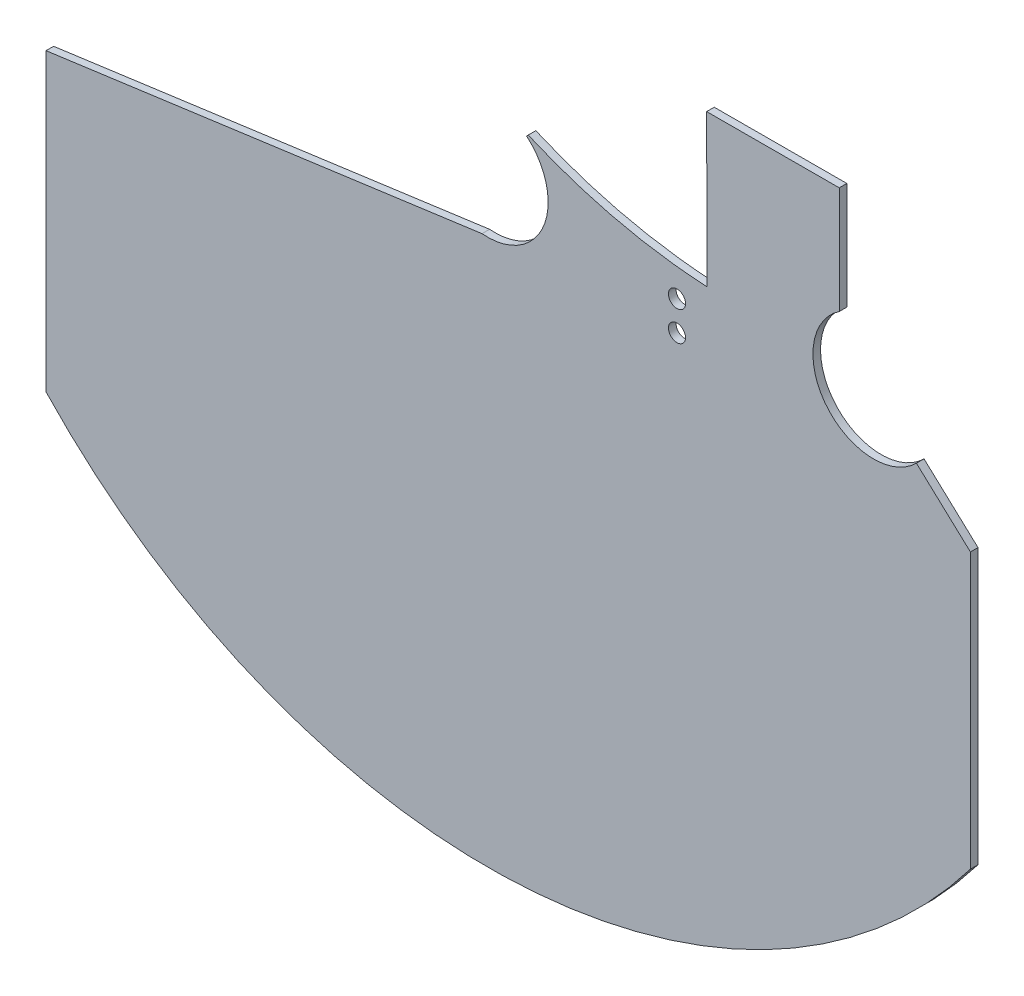
ISO-10303-21;
HEADER;
FILE_DESCRIPTION(('STEP AP214'),'2;1');
FILE_NAME('part.step','',(''),(''),'','','');
FILE_SCHEMA(('AUTOMOTIVE_DESIGN { 1 0 10303 214 1 1 1 1 }'));
ENDSEC;
DATA;
#1=APPLICATION_CONTEXT('core data for automotive mechanical design processes');
#2=APPLICATION_PROTOCOL_DEFINITION('international standard','automotive_design',2000,#1);
#3=PRODUCT_CONTEXT('',#1,'mechanical');
#4=PRODUCT('Part','Part','',(#3));
#5=PRODUCT_RELATED_PRODUCT_CATEGORY('part','',(#4));
#6=PRODUCT_DEFINITION_FORMATION('','',#4);
#7=PRODUCT_DEFINITION_CONTEXT('part definition',#1,'design');
#8=PRODUCT_DEFINITION('design','',#6,#7);
#9=PRODUCT_DEFINITION_SHAPE('','',#8);
#10=(LENGTH_UNIT() NAMED_UNIT(*) SI_UNIT(.MILLI.,.METRE.));
#11=(NAMED_UNIT(*) PLANE_ANGLE_UNIT() SI_UNIT($,.RADIAN.));
#12=(NAMED_UNIT(*) SI_UNIT($,.STERADIAN.) SOLID_ANGLE_UNIT());
#13=UNCERTAINTY_MEASURE_WITH_UNIT(LENGTH_MEASURE(1.E-05),#10,'distance_accuracy_value','');
#14=(GEOMETRIC_REPRESENTATION_CONTEXT(3) GLOBAL_UNCERTAINTY_ASSIGNED_CONTEXT((#13)) GLOBAL_UNIT_ASSIGNED_CONTEXT((#10,
#11,#12)) REPRESENTATION_CONTEXT('',''));
#15=CARTESIAN_POINT('',(0.,0.,0.));
#16=DIRECTION('',(0.,0.,1.));
#17=DIRECTION('',(1.,0.,0.));
#18=AXIS2_PLACEMENT_3D('',#15,#16,#17);
#19=CARTESIAN_POINT('',(-64.6239887447356,-14.0460748970825,2.));
#20=CARTESIAN_POINT('',(-63.2083175092721,-14.6547052125629,2.));
#21=CARTESIAN_POINT('',(-59.2352547633828,-16.2885486222811,2.));
#22=CARTESIAN_POINT('',(-52.6835599549813,-18.6412966622868,2.));
#23=CARTESIAN_POINT('',(-44.8960667093759,-20.9332737764106,2.));
#24=CARTESIAN_POINT('',(-33.2641089987974,-23.6191312021915,2.));
#25=CARTESIAN_POINT('',(-24.0616058058238,-24.7787283025548,2.));
#26=CARTESIAN_POINT('',(-17.4428852931268,-25.1385360129051,2.));
#27=B_SPLINE_CURVE_WITH_KNOTS('',3,(#19,#20,#21,#22,#23,#24,#25,#26),.UNSPECIFIED.,.F.,.F.,(4,1,
1,1,1,4),(0.0547903109001073,0.11986733723747,0.23631613153048,0.35276492582349,0.4692137201165,
0.751953644688164),.UNSPECIFIED.);
#28=DIRECTION('',(0.,0.,-1.));
#29=VECTOR('',#28,1.);
#30=SURFACE_OF_LINEAR_EXTRUSION('',#27,#29);
#31=CARTESIAN_POINT('',(-64.6239887447356,-14.0460748970825,0.));
#32=CARTESIAN_POINT('',(-63.2083175092721,-14.6547052125629,0.));
#33=CARTESIAN_POINT('',(-59.2352547633828,-16.2885486222811,0.));
#34=CARTESIAN_POINT('',(-52.6835599549813,-18.6412966622868,0.));
#35=CARTESIAN_POINT('',(-44.8960667093759,-20.9332737764106,0.));
#36=CARTESIAN_POINT('',(-33.2641089987974,-23.6191312021915,0.));
#37=CARTESIAN_POINT('',(-24.0616058058238,-24.7787283025548,0.));
#38=CARTESIAN_POINT('',(-17.4428852931268,-25.1385360129051,0.));
#39=B_SPLINE_CURVE_WITH_KNOTS('',3,(#31,#32,#33,#34,#35,#36,#37,#38),.UNSPECIFIED.,.F.,.F.,(4,1,
1,1,1,4),(0.0547903109001073,0.11986733723747,0.23631613153048,0.35276492582349,0.4692137201165,
0.751953644688164),.UNSPECIFIED.);
#40=CARTESIAN_POINT('',(-64.6239887448273,-14.0460748970428,0.));
#41=VERTEX_POINT('',#40);
#42=CARTESIAN_POINT('',(-17.4428852931608,-25.1385360129033,0.));
#43=VERTEX_POINT('',#42);
#44=EDGE_CURVE('E159',#41,#43,#39,.T.);
#45=ORIENTED_EDGE('',*,*,#44,.F.);
#46=DIRECTION('',(0.,0.,-1.));
#47=VECTOR('',#46,1.);
#48=CARTESIAN_POINT('',(-64.6239887448273,-14.0460748970428,2.));
#49=LINE('',#48,#47);
#50=CARTESIAN_POINT('',(-64.6239887448273,-14.0460748970428,2.));
#51=VERTEX_POINT('',#50);
#52=EDGE_CURVE('E11',#51,#41,#49,.T.);
#53=ORIENTED_EDGE('',*,*,#52,.F.);
#54=CARTESIAN_POINT('',(-17.4428852931608,-25.1385360129033,2.));
#55=VERTEX_POINT('',#54);
#56=EDGE_CURVE('E201',#51,#55,#27,.T.);
#57=ORIENTED_EDGE('',*,*,#56,.T.);
#58=DIRECTION('',(0.,0.,-1.));
#59=VECTOR('',#58,1.);
#60=CARTESIAN_POINT('',(-17.4428852931608,-25.1385360129033,2.));
#61=LINE('',#60,#59);
#62=EDGE_CURVE('E98',#55,#43,#61,.T.);
#63=ORIENTED_EDGE('',*,*,#62,.T.);
#64=EDGE_LOOP('',(#45,#53,#57,#63));
#65=FACE_BOUND('',#64,.T.);
#66=ADVANCED_FACE('F35',(#65),#30,.T.);
#67=CARTESIAN_POINT('',(-25.2889529104566,25.2889560515686,2.));
#68=DIRECTION('',(-0.707106737272085,0.707106825101007,0.));
#69=DIRECTION('',(-0.707106825101007,-0.707106737272085,0.));
#70=AXIS2_PLACEMENT_3D('',#67,#68,#69);
#71=PLANE('',#70);
#72=DIRECTION('',(0.707106825101007,0.707106737272085,0.));
#73=VECTOR('',#72,1.);
#74=CARTESIAN_POINT('',(-25.2889529104566,25.2889560515686,0.));
#75=LINE('',#74,#73);
#76=CARTESIAN_POINT('',(-65.0722011186989,-14.4942872152425,0.));
#77=VERTEX_POINT('',#76);
#78=EDGE_CURVE('E164',#77,#41,#75,.T.);
#79=ORIENTED_EDGE('',*,*,#78,.F.);
#80=DIRECTION('',(0.,0.,-1.));
#81=VECTOR('',#80,1.);
#82=CARTESIAN_POINT('',(-65.0722011186989,-14.4942872152425,2.));
#83=LINE('',#82,#81);
#84=CARTESIAN_POINT('',(-65.0722011186989,-14.4942872152425,2.));
#85=VERTEX_POINT('',#84);
#86=EDGE_CURVE('E44',#85,#77,#83,.T.);
#87=ORIENTED_EDGE('',*,*,#86,.F.);
#88=DIRECTION('',(0.707106825101007,0.707106737272085,0.));
#89=VECTOR('',#88,1.);
#90=CARTESIAN_POINT('',(-25.2889529104566,25.2889560515686,2.));
#91=LINE('',#90,#89);
#92=EDGE_CURVE('E232',#85,#51,#91,.T.);
#93=ORIENTED_EDGE('',*,*,#92,.T.);
#94=ORIENTED_EDGE('',*,*,#52,.T.);
#95=EDGE_LOOP('',(#79,#87,#93,#94));
#96=FACE_BOUND('',#95,.T.);
#97=ADVANCED_FACE('F231',(#96),#71,.T.);
#98=CARTESIAN_POINT('',(-75.3616109764839,-26.7469622202588,2.));
#99=DIRECTION('',(0.,0.,-1.));
#100=DIRECTION('',(-1.,0.,0.));
#101=AXIS2_PLACEMENT_3D('',#98,#99,#100);
#102=CYLINDRICAL_SURFACE('',#101,15.9999999999994);
#103=CARTESIAN_POINT('',(-75.3616109764839,-26.7469622202588,0.));
#104=DIRECTION('',(0.,0.,1.));
#105=DIRECTION('',(1.,0.,0.));
#106=AXIS2_PLACEMENT_3D('',#103,#104,#105);
#107=CIRCLE('',#106,15.9999999999994);
#108=CARTESIAN_POINT('',(-76.8108861217814,-42.6811895800385,0.));
#109=VERTEX_POINT('',#108);
#110=EDGE_CURVE('E170',#77,#109,#107,.F.);
#111=ORIENTED_EDGE('',*,*,#110,.T.);
#112=DIRECTION('',(0.,0.,-1.));
#113=VECTOR('',#112,1.);
#114=CARTESIAN_POINT('',(-76.8108861217814,-42.6811895800385,2.));
#115=LINE('',#114,#113);
#116=CARTESIAN_POINT('',(-76.8108861217814,-42.6811895800385,2.));
#117=VERTEX_POINT('',#116);
#118=EDGE_CURVE('E215',#117,#109,#115,.T.);
#119=ORIENTED_EDGE('',*,*,#118,.F.);
#120=CARTESIAN_POINT('',(-75.3616109764839,-26.7469622202588,2.));
#121=DIRECTION('',(0.,0.,1.));
#122=DIRECTION('',(1.,0.,0.));
#123=AXIS2_PLACEMENT_3D('',#120,#121,#122);
#124=CIRCLE('',#123,15.9999999999994);
#125=EDGE_CURVE('E222',#85,#117,#124,.F.);
#126=ORIENTED_EDGE('',*,*,#125,.F.);
#127=ORIENTED_EDGE('',*,*,#86,.T.);
#128=EDGE_LOOP('',(#111,#119,#126,#127));
#129=FACE_BOUND('',#128,.T.);
#130=ADVANCED_FACE('F220',(#129),#102,.F.);
#131=CARTESIAN_POINT('',(4.31519357882489,-31.6044268128314,2.));
#132=DIRECTION('',(0.135282451096762,-0.990807074270896,0.));
#133=DIRECTION('',(0.990807074270896,0.135282451096762,0.));
#134=AXIS2_PLACEMENT_3D('',#131,#132,#133);
#135=PLANE('',#134);
#136=DIRECTION('',(-0.990807074270896,-0.135282451096762,0.));
#137=VECTOR('',#136,1.);
#138=CARTESIAN_POINT('',(4.31519357882489,-31.6044268128314,0.));
#139=LINE('',#138,#137);
#140=CARTESIAN_POINT('',(-191.898124009468,-58.39492844576,0.));
#141=VERTEX_POINT('',#140);
#142=EDGE_CURVE('E172',#109,#141,#139,.T.);
#143=ORIENTED_EDGE('',*,*,#142,.T.);
#144=DIRECTION('',(0.,0.,-1.));
#145=VECTOR('',#144,1.);
#146=CARTESIAN_POINT('',(-191.898124009468,-58.39492844576,2.));
#147=LINE('',#146,#145);
#148=CARTESIAN_POINT('',(-191.898124009468,-58.39492844576,2.));
#149=VERTEX_POINT('',#148);
#150=EDGE_CURVE('E213',#149,#141,#147,.T.);
#151=ORIENTED_EDGE('',*,*,#150,.F.);
#152=DIRECTION('',(-0.990807074270896,-0.135282451096762,0.));
#153=VECTOR('',#152,1.);
#154=CARTESIAN_POINT('',(4.31519357882489,-31.6044268128314,2.));
#155=LINE('',#154,#153);
#156=EDGE_CURVE('E243',#117,#149,#155,.T.);
#157=ORIENTED_EDGE('',*,*,#156,.F.);
#158=ORIENTED_EDGE('',*,*,#118,.T.);
#159=EDGE_LOOP('',(#143,#151,#157,#158));
#160=FACE_BOUND('',#159,.T.);
#161=ADVANCED_FACE('F277',(#160),#135,.F.);
#162=CARTESIAN_POINT('',(-191.898124009504,-1.16508970540198E-10,2.));
#163=DIRECTION('',(-1.,-6.07139705724417E-13,0.));
#164=DIRECTION('',(6.07139705724417E-13,-1.,0.));
#165=AXIS2_PLACEMENT_3D('',#162,#163,#164);
#166=PLANE('',#165);
#167=DIRECTION('',(-6.07139705724417E-13,1.,0.));
#168=VECTOR('',#167,1.);
#169=CARTESIAN_POINT('',(-191.898124009504,-1.16508970540198E-10,0.));
#170=LINE('',#169,#168);
#171=CARTESIAN_POINT('',(-191.898124009468,-136.379261886521,0.));
#172=VERTEX_POINT('',#171);
#173=EDGE_CURVE('E175',#172,#141,#170,.T.);
#174=ORIENTED_EDGE('',*,*,#173,.F.);
#175=DIRECTION('',(0.,0.,-1.));
#176=VECTOR('',#175,1.);
#177=CARTESIAN_POINT('',(-191.898124009468,-136.379261886521,2.));
#178=LINE('',#177,#176);
#179=CARTESIAN_POINT('',(-191.898124009468,-136.379261886521,2.));
#180=VERTEX_POINT('',#179);
#181=EDGE_CURVE('E211',#180,#172,#178,.T.);
#182=ORIENTED_EDGE('',*,*,#181,.F.);
#183=DIRECTION('',(-6.07139705724417E-13,1.,0.));
#184=VECTOR('',#183,1.);
#185=CARTESIAN_POINT('',(-191.898124009504,-1.16508970540198E-10,2.));
#186=LINE('',#185,#184);
#187=EDGE_CURVE('E245',#180,#149,#186,.T.);
#188=ORIENTED_EDGE('',*,*,#187,.T.);
#189=ORIENTED_EDGE('',*,*,#150,.T.);
#190=EDGE_LOOP('',(#174,#182,#188,#189));
#191=FACE_BOUND('',#190,.T.);
#192=ADVANCED_FACE('F272',(#191),#166,.T.);
#193=CARTESIAN_POINT('',(-75.3616109764839,-26.7469622202588,2.));
#194=DIRECTION('',(0.,0.,-1.));
#195=DIRECTION('',(-1.,0.,0.));
#196=AXIS2_PLACEMENT_3D('',#193,#194,#195);
#197=CYLINDRICAL_SURFACE('',#196,160.);
#198=CARTESIAN_POINT('',(-75.3616109764839,-26.7469622202588,0.));
#199=DIRECTION('',(0.,0.,1.));
#200=DIRECTION('',(1.,0.,0.));
#201=AXIS2_PLACEMENT_3D('',#198,#199,#200);
#202=CIRCLE('',#201,160.);
#203=CARTESIAN_POINT('',(52.0837216082465,-123.482101659696,0.));
#204=VERTEX_POINT('',#203);
#205=EDGE_CURVE('E178',#172,#204,#202,.T.);
#206=ORIENTED_EDGE('',*,*,#205,.T.);
#207=DIRECTION('',(0.,0.,-1.));
#208=VECTOR('',#207,1.);
#209=CARTESIAN_POINT('',(52.0837216082465,-123.482101659696,2.));
#210=LINE('',#209,#208);
#211=CARTESIAN_POINT('',(52.0837216082465,-123.482101659696,2.));
#212=VERTEX_POINT('',#211);
#213=EDGE_CURVE('E209',#212,#204,#210,.T.);
#214=ORIENTED_EDGE('',*,*,#213,.F.);
#215=CARTESIAN_POINT('',(-75.3616109764839,-26.7469622202588,2.));
#216=DIRECTION('',(0.,0.,1.));
#217=DIRECTION('',(1.,0.,0.));
#218=AXIS2_PLACEMENT_3D('',#215,#216,#217);
#219=CIRCLE('',#218,160.);
#220=EDGE_CURVE('E248',#180,#212,#219,.T.);
#221=ORIENTED_EDGE('',*,*,#220,.F.);
#222=ORIENTED_EDGE('',*,*,#181,.T.);
#223=EDGE_LOOP('',(#206,#214,#221,#222));
#224=FACE_BOUND('',#223,.T.);
#225=ADVANCED_FACE('F269',(#224),#197,.T.);
#226=CARTESIAN_POINT('',(52.0837216082473,-3.33998055448493E-13,2.));
#227=DIRECTION('',(1.,0.,0.));
#228=DIRECTION('',(0.,1.,0.));
#229=AXIS2_PLACEMENT_3D('',#226,#227,#228);
#230=PLANE('',#229);
#231=DIRECTION('',(0.,-1.,0.));
#232=VECTOR('',#231,1.);
#233=CARTESIAN_POINT('',(52.0837216082473,-3.33998055448493E-13,0.));
#234=LINE('',#233,#232);
#235=CARTESIAN_POINT('',(52.083721608247,-50.9845866737982,0.));
#236=VERTEX_POINT('',#235);
#237=EDGE_CURVE('E181',#236,#204,#234,.T.);
#238=ORIENTED_EDGE('',*,*,#237,.F.);
#239=DIRECTION('',(0.,0.,-1.));
#240=VECTOR('',#239,1.);
#241=CARTESIAN_POINT('',(52.083721608247,-50.9845866737982,2.));
#242=LINE('',#241,#240);
#243=CARTESIAN_POINT('',(52.083721608247,-50.9845866737982,2.));
#244=VERTEX_POINT('',#243);
#245=EDGE_CURVE('E207',#244,#236,#242,.T.);
#246=ORIENTED_EDGE('',*,*,#245,.F.);
#247=DIRECTION('',(0.,-1.,0.));
#248=VECTOR('',#247,1.);
#249=CARTESIAN_POINT('',(52.0837216082473,-3.33998055448493E-13,2.));
#250=LINE('',#249,#248);
#251=EDGE_CURVE('E250',#244,#212,#250,.T.);
#252=ORIENTED_EDGE('',*,*,#251,.T.);
#253=ORIENTED_EDGE('',*,*,#213,.T.);
#254=EDGE_LOOP('',(#238,#246,#252,#253));
#255=FACE_BOUND('',#254,.T.);
#256=ADVANCED_FACE('F263',(#255),#230,.T.);
#257=CARTESIAN_POINT('',(-1.43735793991193,-1.55637741681561,2.));
#258=DIRECTION('',(-0.67845895912902,-0.734638306091894,0.));
#259=DIRECTION('',(0.734638306091894,-0.67845895912902,0.));
#260=AXIS2_PLACEMENT_3D('',#257,#258,#259);
#261=PLANE('',#260);
#262=DIRECTION('',(-0.734638306091894,0.67845895912902,0.));
#263=VECTOR('',#262,1.);
#264=CARTESIAN_POINT('',(-1.43735793991193,-1.55637741681561,0.));
#265=LINE('',#264,#263);
#266=CARTESIAN_POINT('',(37.8349632323001,-37.8254610245341,0.));
#267=VERTEX_POINT('',#266);
#268=EDGE_CURVE('E184',#236,#267,#265,.T.);
#269=ORIENTED_EDGE('',*,*,#268,.T.);
#270=DIRECTION('',(0.,0.,-1.));
#271=VECTOR('',#270,1.);
#272=CARTESIAN_POINT('',(37.8349632323001,-37.8254610245341,2.));
#273=LINE('',#272,#271);
#274=CARTESIAN_POINT('',(37.8349632323001,-37.8254610245341,2.));
#275=VERTEX_POINT('',#274);
#276=EDGE_CURVE('E205',#275,#267,#273,.T.);
#277=ORIENTED_EDGE('',*,*,#276,.F.);
#278=DIRECTION('',(-0.734638306091894,0.67845895912902,0.));
#279=VECTOR('',#278,1.);
#280=CARTESIAN_POINT('',(-1.43735793991193,-1.55637741681561,2.));
#281=LINE('',#280,#279);
#282=EDGE_CURVE('E253',#244,#275,#281,.T.);
#283=ORIENTED_EDGE('',*,*,#282,.F.);
#284=ORIENTED_EDGE('',*,*,#245,.T.);
#285=EDGE_LOOP('',(#269,#277,#283,#284));
#286=FACE_BOUND('',#285,.T.);
#287=ADVANCED_FACE('F278',(#286),#261,.F.);
#288=CARTESIAN_POINT('',(26.5181075061683,-26.5149399160011,2.));
#289=DIRECTION('',(0.,0.,-1.));
#290=DIRECTION('',(-1.,0.,0.));
#291=AXIS2_PLACEMENT_3D('',#288,#289,#290);
#292=CYLINDRICAL_SURFACE('',#291,15.999972227226);
#293=CARTESIAN_POINT('',(26.5181075061683,-26.5149399160011,0.));
#294=DIRECTION('',(0.,0.,1.));
#295=DIRECTION('',(1.,0.,0.));
#296=AXIS2_PLACEMENT_3D('',#293,#294,#295);
#297=CIRCLE('',#296,15.999972227226);
#298=CARTESIAN_POINT('',(17.5302847513142,-13.2779405053084,0.));
#299=VERTEX_POINT('',#298);
#300=EDGE_CURVE('E187',#299,#267,#297,.T.);
#301=ORIENTED_EDGE('',*,*,#300,.F.);
#302=DIRECTION('',(0.,0.,-1.));
#303=VECTOR('',#302,1.);
#304=CARTESIAN_POINT('',(17.5302847513142,-13.2779405053084,2.));
#305=LINE('',#304,#303);
#306=CARTESIAN_POINT('',(17.5302847513142,-13.2779405053084,2.));
#307=VERTEX_POINT('',#306);
#308=EDGE_CURVE('E146',#307,#299,#305,.T.);
#309=ORIENTED_EDGE('',*,*,#308,.F.);
#310=CARTESIAN_POINT('',(26.5181075061683,-26.5149399160011,2.));
#311=DIRECTION('',(0.,0.,1.));
#312=DIRECTION('',(1.,0.,0.));
#313=AXIS2_PLACEMENT_3D('',#310,#311,#312);
#314=CIRCLE('',#313,15.999972227226);
#315=EDGE_CURVE('E135',#307,#275,#314,.T.);
#316=ORIENTED_EDGE('',*,*,#315,.T.);
#317=ORIENTED_EDGE('',*,*,#276,.T.);
#318=EDGE_LOOP('',(#301,#309,#316,#317));
#319=FACE_BOUND('',#318,.T.);
#320=ADVANCED_FACE('F256',(#319),#292,.F.);
#321=CARTESIAN_POINT('',(17.4999546172967,0.0398546428247218,2.));
#322=DIRECTION('',(-0.999997406702671,-0.00227740816141267,0.));
#323=DIRECTION('',(0.00227740816141267,-0.999997406702671,0.));
#324=AXIS2_PLACEMENT_3D('',#321,#322,#323);
#325=PLANE('',#324);
#326=DIRECTION('',(-0.00227740816141267,0.999997406702671,0.));
#327=VECTOR('',#326,1.);
#328=CARTESIAN_POINT('',(17.4999546172967,0.0398546428247218,0.));
#329=LINE('',#328,#327);
#330=CARTESIAN_POINT('',(17.4660181629812,14.941165212962,0.));
#331=VERTEX_POINT('',#330);
#332=EDGE_CURVE('E142',#299,#331,#329,.T.);
#333=ORIENTED_EDGE('',*,*,#332,.T.);
#334=DIRECTION('',(0.,0.,-1.));
#335=VECTOR('',#334,1.);
#336=CARTESIAN_POINT('',(17.4660181629812,14.941165212962,2.));
#337=LINE('',#336,#335);
#338=CARTESIAN_POINT('',(17.4660181629812,14.941165212962,2.));
#339=VERTEX_POINT('',#338);
#340=EDGE_CURVE('E139',#339,#331,#337,.T.);
#341=ORIENTED_EDGE('',*,*,#340,.F.);
#342=DIRECTION('',(-0.00227740816141267,0.999997406702671,0.));
#343=VECTOR('',#342,1.);
#344=CARTESIAN_POINT('',(17.4999546172967,0.0398546428247218,2.));
#345=LINE('',#344,#343);
#346=EDGE_CURVE('E128',#307,#339,#345,.T.);
#347=ORIENTED_EDGE('',*,*,#346,.F.);
#348=ORIENTED_EDGE('',*,*,#308,.T.);
#349=EDGE_LOOP('',(#333,#341,#347,#348));
#350=FACE_BOUND('',#349,.T.);
#351=ADVANCED_FACE('F140',(#350),#325,.F.);
#352=CARTESIAN_POINT('',(-0.0339329442527082,14.9013147113889,2.));
#353=DIRECTION('',(-0.00227717197643046,0.999997407240534,0.));
#354=DIRECTION('',(-0.999997407240534,-0.00227717197643046,0.));
#355=AXIS2_PLACEMENT_3D('',#352,#353,#354);
#356=PLANE('',#355);
#357=DIRECTION('',(0.999997407240534,0.00227717197643046,0.));
#358=VECTOR('',#357,1.);
#359=CARTESIAN_POINT('',(-0.0339329442527082,14.9013147113889,0.));
#360=LINE('',#359,#358);
#361=CARTESIAN_POINT('',(-17.5339818611217,14.8614639870859,0.));
#362=VERTEX_POINT('',#361);
#363=EDGE_CURVE('E191',#362,#331,#360,.T.);
#364=ORIENTED_EDGE('',*,*,#363,.F.);
#365=DIRECTION('',(0.,0.,-1.));
#366=VECTOR('',#365,1.);
#367=CARTESIAN_POINT('',(-17.5339818611217,14.8614639870859,2.));
#368=LINE('',#367,#366);
#369=CARTESIAN_POINT('',(-17.5339818611217,14.8614639870859,2.));
#370=VERTEX_POINT('',#369);
#371=EDGE_CURVE('E91',#370,#362,#368,.T.);
#372=ORIENTED_EDGE('',*,*,#371,.F.);
#373=DIRECTION('',(0.999997407240534,0.00227717197643046,0.));
#374=VECTOR('',#373,1.);
#375=CARTESIAN_POINT('',(-0.0339329442527082,14.9013147113889,2.));
#376=LINE('',#375,#374);
#377=EDGE_CURVE('E133',#370,#339,#376,.T.);
#378=ORIENTED_EDGE('',*,*,#377,.T.);
#379=ORIENTED_EDGE('',*,*,#340,.T.);
#380=EDGE_LOOP('',(#364,#372,#378,#379));
#381=FACE_BOUND('',#380,.T.);
#382=ADVANCED_FACE('F148',(#381),#356,.T.);
#383=CARTESIAN_POINT('',(-25.3616109764847,-39.6212771836165,2.));
#384=DIRECTION('',(0.,0.,-1.));
#385=DIRECTION('',(-1.,0.,0.));
#386=AXIS2_PLACEMENT_3D('',#383,#384,#385);
#387=CYLINDRICAL_SURFACE('',#386,2.24999999999942);
#388=CARTESIAN_POINT('',(-25.3616109764847,-39.6212771836165,2.));
#389=DIRECTION('',(0.,0.,1.));
#390=DIRECTION('',(1.,0.,0.));
#391=AXIS2_PLACEMENT_3D('',#388,#389,#390);
#392=CIRCLE('',#391,2.24999999999942);
#393=CARTESIAN_POINT('',(-23.1116109764853,-39.6212771836165,2.));
#394=VERTEX_POINT('',#393);
#395=EDGE_CURVE('E150',#394,#394,#392,.T.);
#396=ORIENTED_EDGE('',*,*,#395,.T.);
#397=EDGE_LOOP('',(#396));
#398=FACE_BOUND('',#397,.T.);
#399=CARTESIAN_POINT('',(-25.3616109764847,-39.6212771836165,0.));
#400=DIRECTION('',(0.,0.,1.));
#401=DIRECTION('',(1.,0.,0.));
#402=AXIS2_PLACEMENT_3D('',#399,#400,#401);
#403=CIRCLE('',#402,2.24999999999942);
#404=CARTESIAN_POINT('',(-23.1116109764853,-39.6212771836165,0.));
#405=VERTEX_POINT('',#404);
#406=EDGE_CURVE('E195',#405,#405,#403,.T.);
#407=ORIENTED_EDGE('',*,*,#406,.F.);
#408=EDGE_LOOP('',(#407));
#409=FACE_BOUND('',#408,.T.);
#410=ADVANCED_FACE('F336',(#398,#409),#387,.F.);
#411=CARTESIAN_POINT('',(-17.5000453860138,-0.0398548518456685,2.));
#412=DIRECTION('',(0.999997406702371,0.00227740829301095,0.));
#413=DIRECTION('',(-0.00227740829301095,0.999997406702371,0.));
#414=AXIS2_PLACEMENT_3D('',#411,#412,#413);
#415=PLANE('',#414);
#416=DIRECTION('',(0.00227740829301095,-0.999997406702371,0.));
#417=VECTOR('',#416,1.);
#418=CARTESIAN_POINT('',(-17.5000453860138,-0.0398548518456685,0.));
#419=LINE('',#418,#417);
#420=EDGE_CURVE('E193',#362,#43,#419,.T.);
#421=ORIENTED_EDGE('',*,*,#420,.T.);
#422=ORIENTED_EDGE('',*,*,#62,.F.);
#423=DIRECTION('',(0.00227740829301095,-0.999997406702371,0.));
#424=VECTOR('',#423,1.);
#425=CARTESIAN_POINT('',(-17.5000453860138,-0.0398548518456685,2.));
#426=LINE('',#425,#424);
#427=EDGE_CURVE('E52',#370,#55,#426,.T.);
#428=ORIENTED_EDGE('',*,*,#427,.F.);
#429=ORIENTED_EDGE('',*,*,#371,.T.);
#430=EDGE_LOOP('',(#421,#422,#428,#429));
#431=FACE_BOUND('',#430,.T.);
#432=ADVANCED_FACE('F233',(#431),#415,.F.);
#433=CARTESIAN_POINT('',(-25.3616109764847,-31.8312771836165,2.));
#434=DIRECTION('',(0.,0.,-1.));
#435=DIRECTION('',(-1.,0.,0.));
#436=AXIS2_PLACEMENT_3D('',#433,#434,#435);
#437=CYLINDRICAL_SURFACE('',#436,2.25000000000163);
#438=CARTESIAN_POINT('',(-25.3616109764847,-31.8312771836165,2.));
#439=DIRECTION('',(0.,0.,1.));
#440=DIRECTION('',(1.,0.,0.));
#441=AXIS2_PLACEMENT_3D('',#438,#439,#440);
#442=CIRCLE('',#441,2.25000000000163);
#443=CARTESIAN_POINT('',(-23.1116109764831,-31.8312771836165,2.));
#444=VERTEX_POINT('',#443);
#445=EDGE_CURVE('E156',#444,#444,#442,.T.);
#446=ORIENTED_EDGE('',*,*,#445,.T.);
#447=EDGE_LOOP('',(#446));
#448=FACE_BOUND('',#447,.T.);
#449=CARTESIAN_POINT('',(-25.3616109764847,-31.8312771836165,0.));
#450=DIRECTION('',(0.,0.,1.));
#451=DIRECTION('',(1.,0.,0.));
#452=AXIS2_PLACEMENT_3D('',#449,#450,#451);
#453=CIRCLE('',#452,2.25000000000163);
#454=CARTESIAN_POINT('',(-23.1116109764831,-31.8312771836165,0.));
#455=VERTEX_POINT('',#454);
#456=EDGE_CURVE('E198',#455,#455,#453,.T.);
#457=ORIENTED_EDGE('',*,*,#456,.F.);
#458=EDGE_LOOP('',(#457));
#459=FACE_BOUND('',#458,.T.);
#460=ADVANCED_FACE('F354',(#448,#459),#437,.F.);
#461=CARTESIAN_POINT('',(0.,0.,2.));
#462=DIRECTION('',(0.,0.,1.));
#463=DIRECTION('',(1.,0.,0.));
#464=AXIS2_PLACEMENT_3D('',#461,#462,#463);
#465=PLANE('',#464);
#466=ORIENTED_EDGE('',*,*,#56,.F.);
#467=ORIENTED_EDGE('',*,*,#92,.F.);
#468=ORIENTED_EDGE('',*,*,#125,.T.);
#469=ORIENTED_EDGE('',*,*,#156,.T.);
#470=ORIENTED_EDGE('',*,*,#187,.F.);
#471=ORIENTED_EDGE('',*,*,#220,.T.);
#472=ORIENTED_EDGE('',*,*,#251,.F.);
#473=ORIENTED_EDGE('',*,*,#282,.T.);
#474=ORIENTED_EDGE('',*,*,#315,.F.);
#475=ORIENTED_EDGE('',*,*,#346,.T.);
#476=ORIENTED_EDGE('',*,*,#377,.F.);
#477=ORIENTED_EDGE('',*,*,#427,.T.);
#478=EDGE_LOOP('',(#466,#467,#468,#469,#470,#471,#472,#473,#474,#475,#476,#477));
#479=FACE_BOUND('',#478,.T.);
#480=ORIENTED_EDGE('',*,*,#395,.F.);
#481=EDGE_LOOP('',(#480));
#482=FACE_BOUND('',#481,.T.);
#483=ORIENTED_EDGE('',*,*,#445,.F.);
#484=EDGE_LOOP('',(#483));
#485=FACE_BOUND('',#484,.T.);
#486=ADVANCED_FACE('F130',(#479,#482,#485),#465,.T.);
#487=CARTESIAN_POINT('',(0.,0.,0.));
#488=DIRECTION('',(0.,0.,1.));
#489=DIRECTION('',(1.,0.,0.));
#490=AXIS2_PLACEMENT_3D('',#487,#488,#489);
#491=PLANE('',#490);
#492=ORIENTED_EDGE('',*,*,#44,.T.);
#493=ORIENTED_EDGE('',*,*,#420,.F.);
#494=ORIENTED_EDGE('',*,*,#363,.T.);
#495=ORIENTED_EDGE('',*,*,#332,.F.);
#496=ORIENTED_EDGE('',*,*,#300,.T.);
#497=ORIENTED_EDGE('',*,*,#268,.F.);
#498=ORIENTED_EDGE('',*,*,#237,.T.);
#499=ORIENTED_EDGE('',*,*,#205,.F.);
#500=ORIENTED_EDGE('',*,*,#173,.T.);
#501=ORIENTED_EDGE('',*,*,#142,.F.);
#502=ORIENTED_EDGE('',*,*,#110,.F.);
#503=ORIENTED_EDGE('',*,*,#78,.T.);
#504=EDGE_LOOP('',(#492,#493,#494,#495,#496,#497,#498,#499,#500,#501,#502,#503));
#505=FACE_BOUND('',#504,.T.);
#506=ORIENTED_EDGE('',*,*,#406,.T.);
#507=EDGE_LOOP('',(#506));
#508=FACE_BOUND('',#507,.T.);
#509=ORIENTED_EDGE('',*,*,#456,.T.);
#510=EDGE_LOOP('',(#509));
#511=FACE_BOUND('',#510,.T.);
#512=ADVANCED_FACE('F229',(#505,#508,#511),#491,.F.);
#513=CLOSED_SHELL('',(#66,#97,#130,#161,#192,#225,#256,#287,#320,#351,#382,#410,#432,#460,#486,#512));
#514=MANIFOLD_SOLID_BREP('B2',#513);
#515=ADVANCED_BREP_SHAPE_REPRESENTATION('',(#18,#514),#14);
#516=SHAPE_DEFINITION_REPRESENTATION(#9,#515);
ENDSEC;
END-ISO-10303-21;
